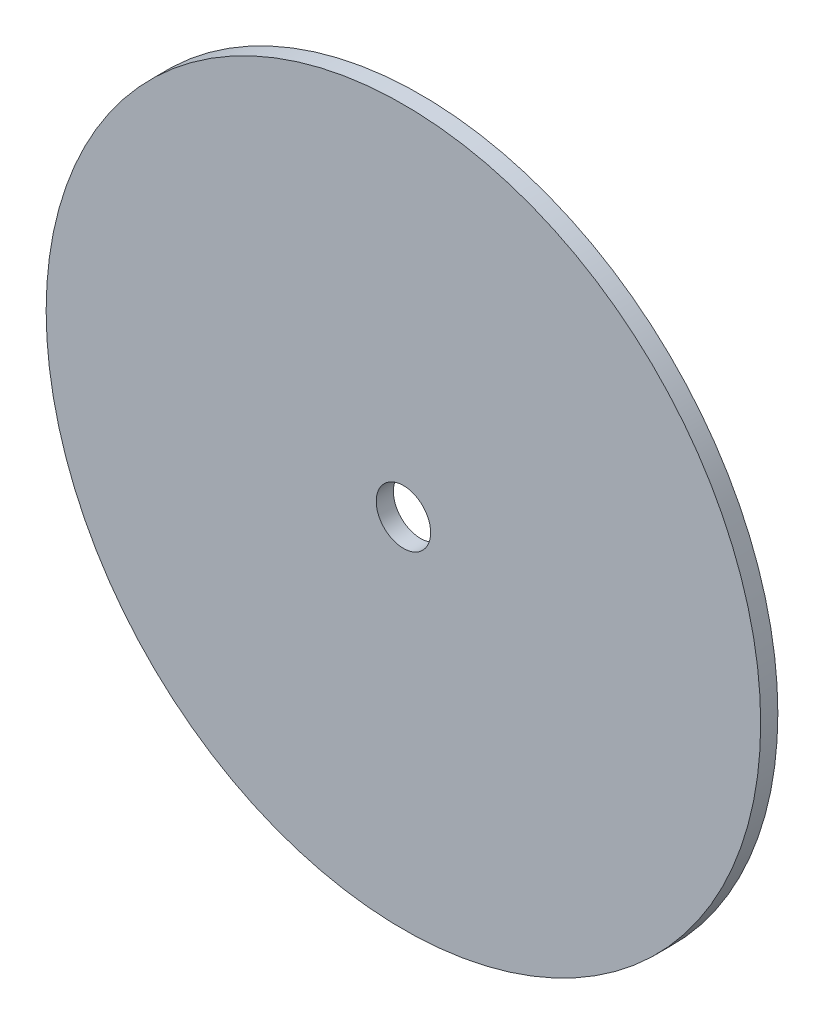
ISO-10303-21;
HEADER;
FILE_DESCRIPTION(('STEP AP214'),'2;1');
FILE_NAME('part.step','',(''),(''),'','','');
FILE_SCHEMA(('AUTOMOTIVE_DESIGN { 1 0 10303 214 1 1 1 1 }'));
ENDSEC;
DATA;
#1=APPLICATION_CONTEXT('core data for automotive mechanical design processes');
#2=APPLICATION_PROTOCOL_DEFINITION('international standard','automotive_design',2000,#1);
#3=PRODUCT_CONTEXT('',#1,'mechanical');
#4=PRODUCT('Part','Part','',(#3));
#5=PRODUCT_RELATED_PRODUCT_CATEGORY('part','',(#4));
#6=PRODUCT_DEFINITION_FORMATION('','',#4);
#7=PRODUCT_DEFINITION_CONTEXT('part definition',#1,'design');
#8=PRODUCT_DEFINITION('design','',#6,#7);
#9=PRODUCT_DEFINITION_SHAPE('','',#8);
#10=(LENGTH_UNIT() NAMED_UNIT(*) SI_UNIT(.MILLI.,.METRE.));
#11=(NAMED_UNIT(*) PLANE_ANGLE_UNIT() SI_UNIT($,.RADIAN.));
#12=(NAMED_UNIT(*) SI_UNIT($,.STERADIAN.) SOLID_ANGLE_UNIT());
#13=UNCERTAINTY_MEASURE_WITH_UNIT(LENGTH_MEASURE(1.E-05),#10,'distance_accuracy_value','');
#14=(GEOMETRIC_REPRESENTATION_CONTEXT(3) GLOBAL_UNCERTAINTY_ASSIGNED_CONTEXT((#13)) GLOBAL_UNIT_ASSIGNED_CONTEXT((#10,
#11,#12)) REPRESENTATION_CONTEXT('',''));
#15=CARTESIAN_POINT('',(0.,0.,0.));
#16=DIRECTION('',(0.,0.,1.));
#17=DIRECTION('',(1.,0.,0.));
#18=AXIS2_PLACEMENT_3D('',#15,#16,#17);
#19=CARTESIAN_POINT('',(0.,9.525,0.));
#20=DIRECTION('',(0.,0.,-1.));
#21=DIRECTION('',(-1.,0.,0.));
#22=AXIS2_PLACEMENT_3D('',#19,#20,#21);
#23=PLANE('',#22);
#24=CARTESIAN_POINT('',(0.,0.,0.));
#25=DIRECTION('',(0.,0.,1.));
#26=DIRECTION('',(1.,0.,0.));
#27=AXIS2_PLACEMENT_3D('',#24,#25,#26);
#28=CIRCLE('',#27,9.525);
#29=CARTESIAN_POINT('',(9.525,0.,0.));
#30=VERTEX_POINT('',#29);
#31=EDGE_CURVE('E49',#30,#30,#28,.T.);
#32=ORIENTED_EDGE('',*,*,#31,.F.);
#33=EDGE_LOOP('',(#32));
#34=FACE_BOUND('',#33,.T.);
#35=CARTESIAN_POINT('',(0.,0.,0.));
#36=DIRECTION('',(0.,0.,1.));
#37=DIRECTION('',(1.,0.,0.));
#38=AXIS2_PLACEMENT_3D('',#35,#36,#37);
#39=CIRCLE('',#38,125.);
#40=CARTESIAN_POINT('',(125.,0.,0.));
#41=VERTEX_POINT('',#40);
#42=EDGE_CURVE('E10',#41,#41,#39,.T.);
#43=ORIENTED_EDGE('',*,*,#42,.T.);
#44=EDGE_LOOP('',(#43));
#45=FACE_BOUND('',#44,.T.);
#46=ADVANCED_FACE('F35',(#34,#45),#23,.F.);
#47=CARTESIAN_POINT('',(0.,0.,0.));
#48=DIRECTION('',(0.,0.,1.));
#49=DIRECTION('',(1.,0.,0.));
#50=AXIS2_PLACEMENT_3D('',#47,#48,#49);
#51=CYLINDRICAL_SURFACE('',#50,125.);
#52=ORIENTED_EDGE('',*,*,#42,.F.);
#53=EDGE_LOOP('',(#52));
#54=FACE_BOUND('',#53,.T.);
#55=CARTESIAN_POINT('',(0.,0.,-6.));
#56=DIRECTION('',(0.,0.,1.));
#57=DIRECTION('',(1.,0.,0.));
#58=AXIS2_PLACEMENT_3D('',#55,#56,#57);
#59=CIRCLE('',#58,125.);
#60=CARTESIAN_POINT('',(125.,0.,-6.));
#61=VERTEX_POINT('',#60);
#62=EDGE_CURVE('E41',#61,#61,#59,.T.);
#63=ORIENTED_EDGE('',*,*,#62,.T.);
#64=EDGE_LOOP('',(#63));
#65=FACE_BOUND('',#64,.T.);
#66=ADVANCED_FACE('F58',(#54,#65),#51,.T.);
#67=CARTESIAN_POINT('',(0.,125.,-6.00000000000001));
#68=DIRECTION('',(0.,0.,1.));
#69=DIRECTION('',(1.,0.,0.));
#70=AXIS2_PLACEMENT_3D('',#67,#68,#69);
#71=PLANE('',#70);
#72=ORIENTED_EDGE('',*,*,#62,.F.);
#73=EDGE_LOOP('',(#72));
#74=FACE_BOUND('',#73,.T.);
#75=CARTESIAN_POINT('',(0.,0.,-6.00000000000001));
#76=DIRECTION('',(0.,0.,1.));
#77=DIRECTION('',(1.,0.,0.));
#78=AXIS2_PLACEMENT_3D('',#75,#76,#77);
#79=CIRCLE('',#78,9.52500000000001);
#80=CARTESIAN_POINT('',(9.52500000000001,0.,-6.00000000000001));
#81=VERTEX_POINT('',#80);
#82=EDGE_CURVE('E45',#81,#81,#79,.T.);
#83=ORIENTED_EDGE('',*,*,#82,.T.);
#84=EDGE_LOOP('',(#83));
#85=FACE_BOUND('',#84,.T.);
#86=ADVANCED_FACE('F62',(#74,#85),#71,.F.);
#87=CARTESIAN_POINT('',(0.,0.,0.));
#88=DIRECTION('',(0.,0.,1.));
#89=DIRECTION('',(1.,0.,0.));
#90=AXIS2_PLACEMENT_3D('',#87,#88,#89);
#91=CYLINDRICAL_SURFACE('',#90,9.525);
#92=ORIENTED_EDGE('',*,*,#82,.F.);
#93=EDGE_LOOP('',(#92));
#94=FACE_BOUND('',#93,.T.);
#95=ORIENTED_EDGE('',*,*,#31,.T.);
#96=EDGE_LOOP('',(#95));
#97=FACE_BOUND('',#96,.T.);
#98=ADVANCED_FACE('F55',(#94,#97),#91,.F.);
#99=CLOSED_SHELL('',(#46,#66,#86,#98));
#100=MANIFOLD_SOLID_BREP('B2',#99);
#101=ADVANCED_BREP_SHAPE_REPRESENTATION('',(#18,#100),#14);
#102=SHAPE_DEFINITION_REPRESENTATION(#9,#101);
ENDSEC;
END-ISO-10303-21;
